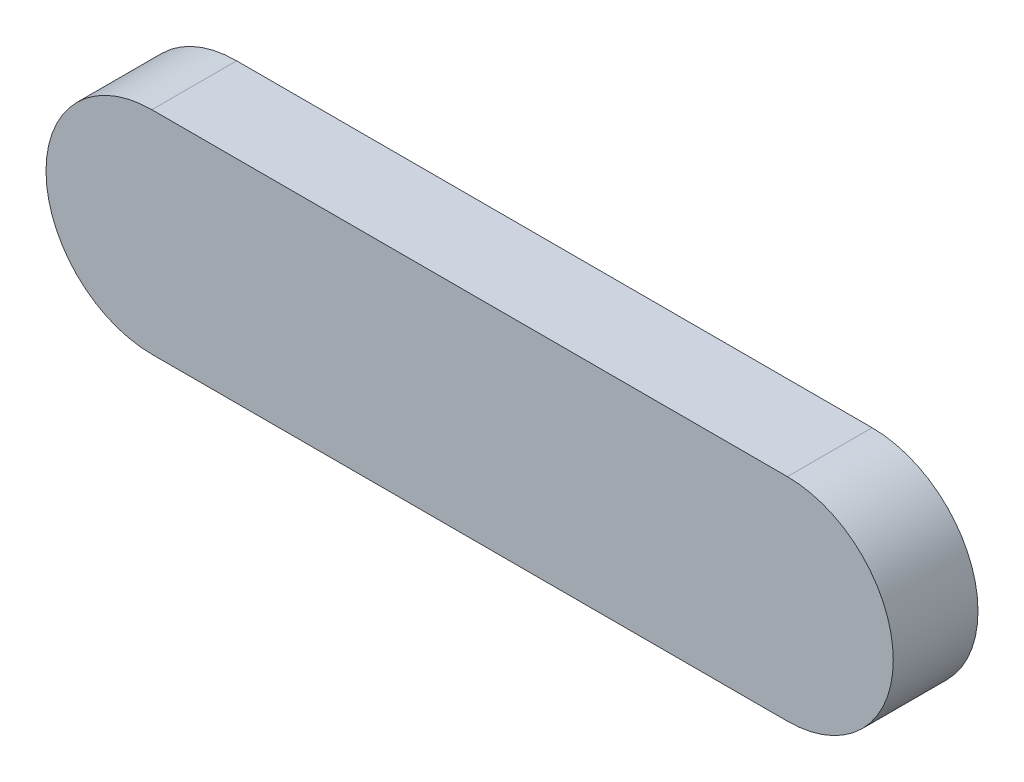
ISO-10303-21;
HEADER;
FILE_DESCRIPTION(('STEP AP214'),'2;1');
FILE_NAME('part.step','',(''),(''),'','','');
FILE_SCHEMA(('AUTOMOTIVE_DESIGN { 1 0 10303 214 1 1 1 1 }'));
ENDSEC;
DATA;
#1=APPLICATION_CONTEXT('core data for automotive mechanical design processes');
#2=APPLICATION_PROTOCOL_DEFINITION('international standard','automotive_design',2000,#1);
#3=PRODUCT_CONTEXT('',#1,'mechanical');
#4=PRODUCT('Part','Part','',(#3));
#5=PRODUCT_RELATED_PRODUCT_CATEGORY('part','',(#4));
#6=PRODUCT_DEFINITION_FORMATION('','',#4);
#7=PRODUCT_DEFINITION_CONTEXT('part definition',#1,'design');
#8=PRODUCT_DEFINITION('design','',#6,#7);
#9=PRODUCT_DEFINITION_SHAPE('','',#8);
#10=(LENGTH_UNIT() NAMED_UNIT(*) SI_UNIT(.MILLI.,.METRE.));
#11=(NAMED_UNIT(*) PLANE_ANGLE_UNIT() SI_UNIT($,.RADIAN.));
#12=(NAMED_UNIT(*) SI_UNIT($,.STERADIAN.) SOLID_ANGLE_UNIT());
#13=UNCERTAINTY_MEASURE_WITH_UNIT(LENGTH_MEASURE(1.E-05),#10,'distance_accuracy_value','');
#14=(GEOMETRIC_REPRESENTATION_CONTEXT(3) GLOBAL_UNCERTAINTY_ASSIGNED_CONTEXT((#13)) GLOBAL_UNIT_ASSIGNED_CONTEXT((#10,
#11,#12)) REPRESENTATION_CONTEXT('',''));
#15=CARTESIAN_POINT('',(0.,0.,0.));
#16=DIRECTION('',(0.,0.,1.));
#17=DIRECTION('',(1.,0.,0.));
#18=AXIS2_PLACEMENT_3D('',#15,#16,#17);
#19=CARTESIAN_POINT('',(0.,0.,20.));
#20=DIRECTION('',(0.,0.,-1.));
#21=DIRECTION('',(-1.,0.,0.));
#22=AXIS2_PLACEMENT_3D('',#19,#20,#21);
#23=CYLINDRICAL_SURFACE('',#22,25.);
#24=CARTESIAN_POINT('',(0.,0.,0.));
#25=DIRECTION('',(0.,0.,1.));
#26=DIRECTION('',(1.,0.,0.));
#27=AXIS2_PLACEMENT_3D('',#24,#25,#26);
#28=CIRCLE('',#27,25.);
#29=CARTESIAN_POINT('',(0.,25.,0.));
#30=VERTEX_POINT('',#29);
#31=CARTESIAN_POINT('',(0.,-25.,0.));
#32=VERTEX_POINT('',#31);
#33=EDGE_CURVE('E102',#30,#32,#28,.T.);
#34=ORIENTED_EDGE('',*,*,#33,.T.);
#35=DIRECTION('',(0.,0.,-1.));
#36=VECTOR('',#35,1.);
#37=CARTESIAN_POINT('',(0.,-25.,20.));
#38=LINE('',#37,#36);
#39=CARTESIAN_POINT('',(0.,-25.,20.));
#40=VERTEX_POINT('',#39);
#41=EDGE_CURVE('E11',#40,#32,#38,.T.);
#42=ORIENTED_EDGE('',*,*,#41,.F.);
#43=CARTESIAN_POINT('',(0.,0.,20.));
#44=DIRECTION('',(0.,0.,1.));
#45=DIRECTION('',(1.,0.,0.));
#46=AXIS2_PLACEMENT_3D('',#43,#44,#45);
#47=CIRCLE('',#46,25.);
#48=CARTESIAN_POINT('',(0.,25.,20.));
#49=VERTEX_POINT('',#48);
#50=EDGE_CURVE('E90',#49,#40,#47,.T.);
#51=ORIENTED_EDGE('',*,*,#50,.F.);
#52=DIRECTION('',(0.,0.,-1.));
#53=VECTOR('',#52,1.);
#54=CARTESIAN_POINT('',(0.,25.,20.));
#55=LINE('',#54,#53);
#56=EDGE_CURVE('E98',#49,#30,#55,.T.);
#57=ORIENTED_EDGE('',*,*,#56,.T.);
#58=EDGE_LOOP('',(#34,#42,#51,#57));
#59=FACE_BOUND('',#58,.T.);
#60=ADVANCED_FACE('F39',(#59),#23,.T.);
#61=CARTESIAN_POINT('',(0.,-25.,20.));
#62=DIRECTION('',(0.,1.,0.));
#63=DIRECTION('',(0.,0.,1.));
#64=AXIS2_PLACEMENT_3D('',#61,#62,#63);
#65=PLANE('',#64);
#66=DIRECTION('',(1.,0.,0.));
#67=VECTOR('',#66,1.);
#68=CARTESIAN_POINT('',(0.,-25.,0.));
#69=LINE('',#68,#67);
#70=CARTESIAN_POINT('',(150.,-25.,0.));
#71=VERTEX_POINT('',#70);
#72=EDGE_CURVE('E94',#32,#71,#69,.T.);
#73=ORIENTED_EDGE('',*,*,#72,.T.);
#74=DIRECTION('',(0.,0.,-1.));
#75=VECTOR('',#74,1.);
#76=CARTESIAN_POINT('',(150.,-25.,20.));
#77=LINE('',#76,#75);
#78=CARTESIAN_POINT('',(150.,-25.,20.));
#79=VERTEX_POINT('',#78);
#80=EDGE_CURVE('E47',#79,#71,#77,.T.);
#81=ORIENTED_EDGE('',*,*,#80,.F.);
#82=DIRECTION('',(1.,0.,0.));
#83=VECTOR('',#82,1.);
#84=CARTESIAN_POINT('',(0.,-25.,20.));
#85=LINE('',#84,#83);
#86=EDGE_CURVE('E85',#40,#79,#85,.T.);
#87=ORIENTED_EDGE('',*,*,#86,.F.);
#88=ORIENTED_EDGE('',*,*,#41,.T.);
#89=EDGE_LOOP('',(#73,#81,#87,#88));
#90=FACE_BOUND('',#89,.T.);
#91=ADVANCED_FACE('F93',(#90),#65,.F.);
#92=CARTESIAN_POINT('',(150.,0.,20.));
#93=DIRECTION('',(0.,0.,-1.));
#94=DIRECTION('',(-1.,0.,0.));
#95=AXIS2_PLACEMENT_3D('',#92,#93,#94);
#96=CYLINDRICAL_SURFACE('',#95,25.);
#97=CARTESIAN_POINT('',(150.,0.,0.));
#98=DIRECTION('',(0.,0.,1.));
#99=DIRECTION('',(1.,0.,0.));
#100=AXIS2_PLACEMENT_3D('',#97,#98,#99);
#101=CIRCLE('',#100,25.);
#102=CARTESIAN_POINT('',(150.,25.,0.));
#103=VERTEX_POINT('',#102);
#104=EDGE_CURVE('E72',#71,#103,#101,.T.);
#105=ORIENTED_EDGE('',*,*,#104,.T.);
#106=DIRECTION('',(0.,0.,-1.));
#107=VECTOR('',#106,1.);
#108=CARTESIAN_POINT('',(150.,25.,20.));
#109=LINE('',#108,#107);
#110=CARTESIAN_POINT('',(150.,25.,20.));
#111=VERTEX_POINT('',#110);
#112=EDGE_CURVE('E95',#111,#103,#109,.T.);
#113=ORIENTED_EDGE('',*,*,#112,.F.);
#114=CARTESIAN_POINT('',(150.,0.,20.));
#115=DIRECTION('',(0.,0.,1.));
#116=DIRECTION('',(1.,0.,0.));
#117=AXIS2_PLACEMENT_3D('',#114,#115,#116);
#118=CIRCLE('',#117,25.);
#119=EDGE_CURVE('E88',#79,#111,#118,.T.);
#120=ORIENTED_EDGE('',*,*,#119,.F.);
#121=ORIENTED_EDGE('',*,*,#80,.T.);
#122=EDGE_LOOP('',(#105,#113,#120,#121));
#123=FACE_BOUND('',#122,.T.);
#124=ADVANCED_FACE('F96',(#123),#96,.T.);
#125=CARTESIAN_POINT('',(0.,25.,20.));
#126=DIRECTION('',(0.,-1.,0.));
#127=DIRECTION('',(0.,0.,-1.));
#128=AXIS2_PLACEMENT_3D('',#125,#126,#127);
#129=PLANE('',#128);
#130=DIRECTION('',(-1.,0.,0.));
#131=VECTOR('',#130,1.);
#132=CARTESIAN_POINT('',(0.,25.,0.));
#133=LINE('',#132,#131);
#134=EDGE_CURVE('E78',#103,#30,#133,.T.);
#135=ORIENTED_EDGE('',*,*,#134,.T.);
#136=ORIENTED_EDGE('',*,*,#56,.F.);
#137=DIRECTION('',(-1.,0.,0.));
#138=VECTOR('',#137,1.);
#139=CARTESIAN_POINT('',(0.,25.,20.));
#140=LINE('',#139,#138);
#141=EDGE_CURVE('E55',#111,#49,#140,.T.);
#142=ORIENTED_EDGE('',*,*,#141,.F.);
#143=ORIENTED_EDGE('',*,*,#112,.T.);
#144=EDGE_LOOP('',(#135,#136,#142,#143));
#145=FACE_BOUND('',#144,.T.);
#146=ADVANCED_FACE('F109',(#145),#129,.F.);
#147=CARTESIAN_POINT('',(0.,0.,20.));
#148=DIRECTION('',(0.,0.,1.));
#149=DIRECTION('',(1.,0.,0.));
#150=AXIS2_PLACEMENT_3D('',#147,#148,#149);
#151=PLANE('',#150);
#152=ORIENTED_EDGE('',*,*,#50,.T.);
#153=ORIENTED_EDGE('',*,*,#86,.T.);
#154=ORIENTED_EDGE('',*,*,#119,.T.);
#155=ORIENTED_EDGE('',*,*,#141,.T.);
#156=EDGE_LOOP('',(#152,#153,#154,#155));
#157=FACE_BOUND('',#156,.T.);
#158=ADVANCED_FACE('F86',(#157),#151,.T.);
#159=CARTESIAN_POINT('',(0.,0.,0.));
#160=DIRECTION('',(0.,0.,1.));
#161=DIRECTION('',(1.,0.,0.));
#162=AXIS2_PLACEMENT_3D('',#159,#160,#161);
#163=PLANE('',#162);
#164=ORIENTED_EDGE('',*,*,#33,.F.);
#165=ORIENTED_EDGE('',*,*,#134,.F.);
#166=ORIENTED_EDGE('',*,*,#104,.F.);
#167=ORIENTED_EDGE('',*,*,#72,.F.);
#168=EDGE_LOOP('',(#164,#165,#166,#167));
#169=FACE_BOUND('',#168,.T.);
#170=ADVANCED_FACE('F112',(#169),#163,.F.);
#171=CLOSED_SHELL('',(#60,#91,#124,#146,#158,#170));
#172=MANIFOLD_SOLID_BREP('B2',#171);
#173=ADVANCED_BREP_SHAPE_REPRESENTATION('',(#18,#172),#14);
#174=SHAPE_DEFINITION_REPRESENTATION(#9,#173);
ENDSEC;
END-ISO-10303-21;
